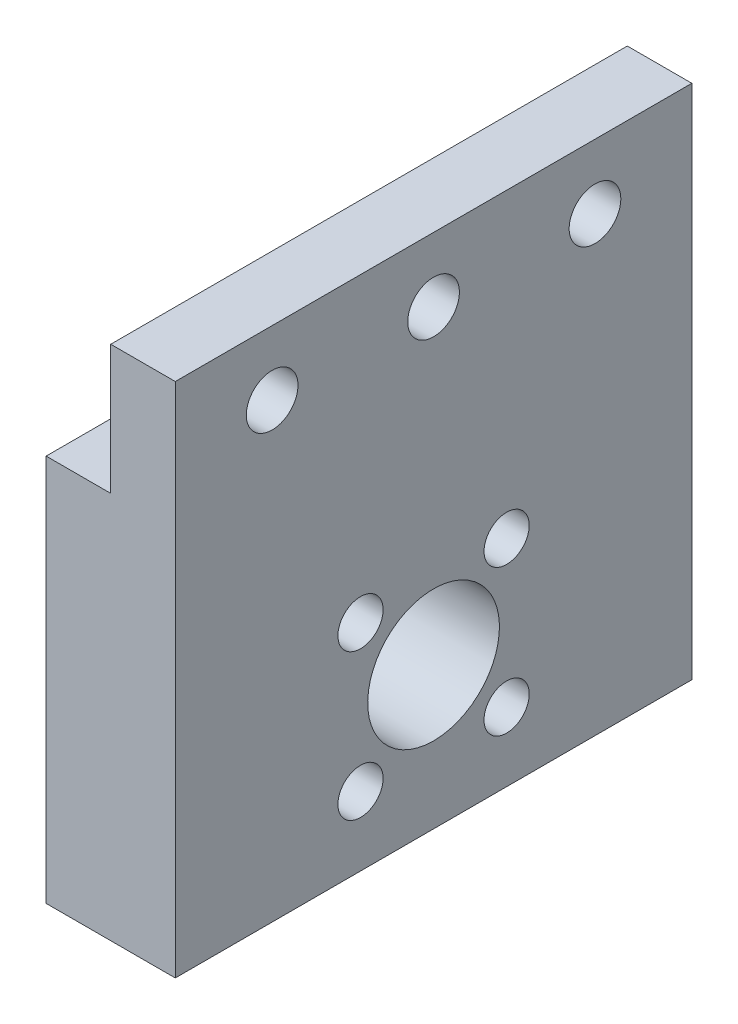
ISO-10303-21;
HEADER;
FILE_DESCRIPTION(('STEP AP214'),'2;1');
FILE_NAME('part.step','',(''),(''),'','','');
FILE_SCHEMA(('AUTOMOTIVE_DESIGN { 1 0 10303 214 1 1 1 1 }'));
ENDSEC;
DATA;
#1=APPLICATION_CONTEXT('core data for automotive mechanical design processes');
#2=APPLICATION_PROTOCOL_DEFINITION('international standard','automotive_design',2000,#1);
#3=PRODUCT_CONTEXT('',#1,'mechanical');
#4=PRODUCT('Part','Part','',(#3));
#5=PRODUCT_RELATED_PRODUCT_CATEGORY('part','',(#4));
#6=PRODUCT_DEFINITION_FORMATION('','',#4);
#7=PRODUCT_DEFINITION_CONTEXT('part definition',#1,'design');
#8=PRODUCT_DEFINITION('design','',#6,#7);
#9=PRODUCT_DEFINITION_SHAPE('','',#8);
#10=(LENGTH_UNIT() NAMED_UNIT(*) SI_UNIT(.MILLI.,.METRE.));
#11=(NAMED_UNIT(*) PLANE_ANGLE_UNIT() SI_UNIT($,.RADIAN.));
#12=(NAMED_UNIT(*) SI_UNIT($,.STERADIAN.) SOLID_ANGLE_UNIT());
#13=UNCERTAINTY_MEASURE_WITH_UNIT(LENGTH_MEASURE(1.E-05),#10,'distance_accuracy_value','');
#14=(GEOMETRIC_REPRESENTATION_CONTEXT(3) GLOBAL_UNCERTAINTY_ASSIGNED_CONTEXT((#13)) GLOBAL_UNIT_ASSIGNED_CONTEXT((#10,
#11,#12)) REPRESENTATION_CONTEXT('',''));
#15=CARTESIAN_POINT('',(0.,0.,0.));
#16=DIRECTION('',(0.,0.,1.));
#17=DIRECTION('',(1.,0.,0.));
#18=AXIS2_PLACEMENT_3D('',#15,#16,#17);
#19=CARTESIAN_POINT('',(-10.,0.,20.));
#20=DIRECTION('',(0.,1.,0.));
#21=DIRECTION('',(0.,0.,1.));
#22=AXIS2_PLACEMENT_3D('',#19,#20,#21);
#23=PLANE('',#22);
#24=DIRECTION('',(1.,0.,0.));
#25=VECTOR('',#24,1.);
#26=CARTESIAN_POINT('',(-10.,0.,-20.));
#27=LINE('',#26,#25);
#28=CARTESIAN_POINT('',(-10.,0.,-20.));
#29=VERTEX_POINT('',#28);
#30=CARTESIAN_POINT('',(0.,0.,-20.));
#31=VERTEX_POINT('',#30);
#32=EDGE_CURVE('E110',#29,#31,#27,.T.);
#33=ORIENTED_EDGE('',*,*,#32,.T.);
#34=DIRECTION('',(0.,0.,-1.));
#35=VECTOR('',#34,1.);
#36=CARTESIAN_POINT('',(0.,0.,20.));
#37=LINE('',#36,#35);
#38=CARTESIAN_POINT('',(0.,0.,20.));
#39=VERTEX_POINT('',#38);
#40=EDGE_CURVE('E12',#39,#31,#37,.T.);
#41=ORIENTED_EDGE('',*,*,#40,.F.);
#42=DIRECTION('',(1.,0.,0.));
#43=VECTOR('',#42,1.);
#44=CARTESIAN_POINT('',(-10.,0.,20.));
#45=LINE('',#44,#43);
#46=CARTESIAN_POINT('',(-10.,0.,20.));
#47=VERTEX_POINT('',#46);
#48=EDGE_CURVE('E104',#47,#39,#45,.T.);
#49=ORIENTED_EDGE('',*,*,#48,.F.);
#50=DIRECTION('',(0.,0.,-1.));
#51=VECTOR('',#50,1.);
#52=CARTESIAN_POINT('',(-10.,0.,20.));
#53=LINE('',#52,#51);
#54=EDGE_CURVE('E64',#47,#29,#53,.T.);
#55=ORIENTED_EDGE('',*,*,#54,.T.);
#56=EDGE_LOOP('',(#33,#41,#49,#55));
#57=FACE_BOUND('',#56,.T.);
#58=ADVANCED_FACE('F56',(#57),#23,.F.);
#59=CARTESIAN_POINT('',(0.,0.,20.));
#60=DIRECTION('',(-1.,0.,0.));
#61=DIRECTION('',(0.,0.,1.));
#62=AXIS2_PLACEMENT_3D('',#59,#60,#61);
#63=PLANE('',#62);
#64=CARTESIAN_POINT('',(0.,35.,12.5));
#65=DIRECTION('',(1.,0.,0.));
#66=DIRECTION('',(0.,0.,-1.));
#67=AXIS2_PLACEMENT_3D('',#64,#65,#66);
#68=CIRCLE('',#67,2.);
#69=CARTESIAN_POINT('',(0.,35.,10.5));
#70=VERTEX_POINT('',#69);
#71=EDGE_CURVE('E188',#70,#70,#68,.T.);
#72=ORIENTED_EDGE('',*,*,#71,.F.);
#73=EDGE_LOOP('',(#72));
#74=FACE_BOUND('',#73,.T.);
#75=CARTESIAN_POINT('',(0.,35.,0.));
#76=DIRECTION('',(1.,0.,0.));
#77=DIRECTION('',(0.,0.,-1.));
#78=AXIS2_PLACEMENT_3D('',#75,#76,#77);
#79=CIRCLE('',#78,2.);
#80=CARTESIAN_POINT('',(0.,35.,-2.));
#81=VERTEX_POINT('',#80);
#82=EDGE_CURVE('E182',#81,#81,#79,.T.);
#83=ORIENTED_EDGE('',*,*,#82,.F.);
#84=EDGE_LOOP('',(#83));
#85=FACE_BOUND('',#84,.T.);
#86=CARTESIAN_POINT('',(0.,35.,-12.5));
#87=DIRECTION('',(1.,0.,0.));
#88=DIRECTION('',(0.,0.,-1.));
#89=AXIS2_PLACEMENT_3D('',#86,#87,#88);
#90=CIRCLE('',#89,2.);
#91=CARTESIAN_POINT('',(0.,35.,-14.5));
#92=VERTEX_POINT('',#91);
#93=EDGE_CURVE('E176',#92,#92,#90,.T.);
#94=ORIENTED_EDGE('',*,*,#93,.F.);
#95=EDGE_LOOP('',(#94));
#96=FACE_BOUND('',#95,.T.);
#97=CARTESIAN_POINT('',(0.,5.34314575050762,5.65685424949238));
#98=DIRECTION('',(-1.,0.,0.));
#99=DIRECTION('',(0.,-1.,0.));
#100=AXIS2_PLACEMENT_3D('',#97,#98,#99);
#101=CIRCLE('',#100,1.75);
#102=CARTESIAN_POINT('',(0.,3.59314575050762,5.65685424949238));
#103=VERTEX_POINT('',#102);
#104=EDGE_CURVE('E130',#103,#103,#101,.T.);
#105=ORIENTED_EDGE('',*,*,#104,.T.);
#106=EDGE_LOOP('',(#105));
#107=FACE_BOUND('',#106,.T.);
#108=CARTESIAN_POINT('',(0.,5.34314575050762,-5.65685424949238));
#109=DIRECTION('',(-1.,0.,0.));
#110=DIRECTION('',(0.,-1.,0.));
#111=AXIS2_PLACEMENT_3D('',#108,#109,#110);
#112=CIRCLE('',#111,1.75);
#113=CARTESIAN_POINT('',(0.,3.59314575050762,-5.65685424949238));
#114=VERTEX_POINT('',#113);
#115=EDGE_CURVE('E137',#114,#114,#112,.T.);
#116=ORIENTED_EDGE('',*,*,#115,.T.);
#117=EDGE_LOOP('',(#116));
#118=FACE_BOUND('',#117,.T.);
#119=CARTESIAN_POINT('',(0.,16.6568542494924,-5.65685424949238));
#120=DIRECTION('',(-1.,0.,0.));
#121=DIRECTION('',(0.,-1.,0.));
#122=AXIS2_PLACEMENT_3D('',#119,#120,#121);
#123=CIRCLE('',#122,1.75);
#124=CARTESIAN_POINT('',(0.,14.9068542494924,-5.65685424949238));
#125=VERTEX_POINT('',#124);
#126=EDGE_CURVE('E143',#125,#125,#123,.T.);
#127=ORIENTED_EDGE('',*,*,#126,.T.);
#128=EDGE_LOOP('',(#127));
#129=FACE_BOUND('',#128,.T.);
#130=CARTESIAN_POINT('',(0.,16.6568542494924,5.65685424949238));
#131=DIRECTION('',(-1.,0.,0.));
#132=DIRECTION('',(0.,-1.,0.));
#133=AXIS2_PLACEMENT_3D('',#130,#131,#132);
#134=CIRCLE('',#133,1.75);
#135=CARTESIAN_POINT('',(0.,14.9068542494924,5.65685424949238));
#136=VERTEX_POINT('',#135);
#137=EDGE_CURVE('E149',#136,#136,#134,.T.);
#138=ORIENTED_EDGE('',*,*,#137,.T.);
#139=EDGE_LOOP('',(#138));
#140=FACE_BOUND('',#139,.T.);
#141=CARTESIAN_POINT('',(0.,11.,0.));
#142=DIRECTION('',(-1.,0.,0.));
#143=DIRECTION('',(0.,-1.,0.));
#144=AXIS2_PLACEMENT_3D('',#141,#142,#143);
#145=CIRCLE('',#144,5.1);
#146=CARTESIAN_POINT('',(0.,5.9,0.));
#147=VERTEX_POINT('',#146);
#148=EDGE_CURVE('E115',#147,#147,#145,.T.);
#149=ORIENTED_EDGE('',*,*,#148,.T.);
#150=EDGE_LOOP('',(#149));
#151=FACE_BOUND('',#150,.T.);
#152=DIRECTION('',(0.,1.,0.));
#153=VECTOR('',#152,1.);
#154=CARTESIAN_POINT('',(0.,0.,-20.));
#155=LINE('',#154,#153);
#156=CARTESIAN_POINT('',(0.,40.,-20.));
#157=VERTEX_POINT('',#156);
#158=EDGE_CURVE('E105',#31,#157,#155,.T.);
#159=ORIENTED_EDGE('',*,*,#158,.T.);
#160=DIRECTION('',(0.,0.,1.));
#161=VECTOR('',#160,1.);
#162=CARTESIAN_POINT('',(0.,40.,-20.));
#163=LINE('',#162,#161);
#164=CARTESIAN_POINT('',(0.,40.,20.));
#165=VERTEX_POINT('',#164);
#166=EDGE_CURVE('E134',#157,#165,#163,.T.);
#167=ORIENTED_EDGE('',*,*,#166,.T.);
#168=DIRECTION('',(0.,1.,0.));
#169=VECTOR('',#168,1.);
#170=CARTESIAN_POINT('',(0.,0.,20.));
#171=LINE('',#170,#169);
#172=EDGE_CURVE('E123',#39,#165,#171,.T.);
#173=ORIENTED_EDGE('',*,*,#172,.F.);
#174=ORIENTED_EDGE('',*,*,#40,.T.);
#175=EDGE_LOOP('',(#159,#167,#173,#174));
#176=FACE_BOUND('',#175,.T.);
#177=ADVANCED_FACE('F195',(#74,#85,#96,#107,#118,#129,#140,#151,#176),#63,.F.);
#178=CARTESIAN_POINT('',(-10.,55.,20.));
#179=DIRECTION('',(1.,0.,0.));
#180=DIRECTION('',(0.,1.,0.));
#181=AXIS2_PLACEMENT_3D('',#178,#179,#180);
#182=PLANE('',#181);
#183=CARTESIAN_POINT('',(-10.,5.34314575050762,5.65685424949238));
#184=DIRECTION('',(-1.,0.,0.));
#185=DIRECTION('',(0.,-1.,0.));
#186=AXIS2_PLACEMENT_3D('',#183,#184,#185);
#187=CIRCLE('',#186,1.75);
#188=CARTESIAN_POINT('',(-10.,3.59314575050762,5.65685424949238));
#189=VERTEX_POINT('',#188);
#190=EDGE_CURVE('E133',#189,#189,#187,.T.);
#191=ORIENTED_EDGE('',*,*,#190,.F.);
#192=EDGE_LOOP('',(#191));
#193=FACE_BOUND('',#192,.T.);
#194=CARTESIAN_POINT('',(-10.,5.34314575050762,-5.65685424949238));
#195=DIRECTION('',(-1.,0.,0.));
#196=DIRECTION('',(0.,-1.,0.));
#197=AXIS2_PLACEMENT_3D('',#194,#195,#196);
#198=CIRCLE('',#197,1.75);
#199=CARTESIAN_POINT('',(-10.,3.59314575050762,-5.65685424949238));
#200=VERTEX_POINT('',#199);
#201=EDGE_CURVE('E140',#200,#200,#198,.T.);
#202=ORIENTED_EDGE('',*,*,#201,.F.);
#203=EDGE_LOOP('',(#202));
#204=FACE_BOUND('',#203,.T.);
#205=CARTESIAN_POINT('',(-10.,16.6568542494924,-5.65685424949238));
#206=DIRECTION('',(-1.,0.,0.));
#207=DIRECTION('',(0.,-1.,0.));
#208=AXIS2_PLACEMENT_3D('',#205,#206,#207);
#209=CIRCLE('',#208,1.75);
#210=CARTESIAN_POINT('',(-10.,14.9068542494924,-5.65685424949238));
#211=VERTEX_POINT('',#210);
#212=EDGE_CURVE('E146',#211,#211,#209,.T.);
#213=ORIENTED_EDGE('',*,*,#212,.F.);
#214=EDGE_LOOP('',(#213));
#215=FACE_BOUND('',#214,.T.);
#216=CARTESIAN_POINT('',(-10.,16.6568542494924,5.65685424949238));
#217=DIRECTION('',(-1.,0.,0.));
#218=DIRECTION('',(0.,-1.,0.));
#219=AXIS2_PLACEMENT_3D('',#216,#217,#218);
#220=CIRCLE('',#219,1.75);
#221=CARTESIAN_POINT('',(-10.,14.9068542494924,5.65685424949238));
#222=VERTEX_POINT('',#221);
#223=EDGE_CURVE('E128',#222,#222,#220,.T.);
#224=ORIENTED_EDGE('',*,*,#223,.F.);
#225=EDGE_LOOP('',(#224));
#226=FACE_BOUND('',#225,.T.);
#227=CARTESIAN_POINT('',(-10.,11.,0.));
#228=DIRECTION('',(-1.,0.,0.));
#229=DIRECTION('',(0.,-1.,0.));
#230=AXIS2_PLACEMENT_3D('',#227,#228,#229);
#231=CIRCLE('',#230,5.1);
#232=CARTESIAN_POINT('',(-10.,5.9,0.));
#233=VERTEX_POINT('',#232);
#234=EDGE_CURVE('E119',#233,#233,#231,.T.);
#235=ORIENTED_EDGE('',*,*,#234,.F.);
#236=EDGE_LOOP('',(#235));
#237=FACE_BOUND('',#236,.T.);
#238=DIRECTION('',(0.,-1.,0.));
#239=VECTOR('',#238,1.);
#240=CARTESIAN_POINT('',(-10.,55.,20.));
#241=LINE('',#240,#239);
#242=CARTESIAN_POINT('',(-10.,30.,20.));
#243=VERTEX_POINT('',#242);
#244=EDGE_CURVE('E80',#243,#47,#241,.T.);
#245=ORIENTED_EDGE('',*,*,#244,.F.);
#246=DIRECTION('',(0.,0.,1.));
#247=VECTOR('',#246,1.);
#248=CARTESIAN_POINT('',(-10.,30.,-20.));
#249=LINE('',#248,#247);
#250=CARTESIAN_POINT('',(-10.,30.,-20.));
#251=VERTEX_POINT('',#250);
#252=EDGE_CURVE('E100',#251,#243,#249,.T.);
#253=ORIENTED_EDGE('',*,*,#252,.F.);
#254=DIRECTION('',(0.,-1.,0.));
#255=VECTOR('',#254,1.);
#256=CARTESIAN_POINT('',(-10.,55.,-20.));
#257=LINE('',#256,#255);
#258=EDGE_CURVE('E94',#251,#29,#257,.T.);
#259=ORIENTED_EDGE('',*,*,#258,.T.);
#260=ORIENTED_EDGE('',*,*,#54,.F.);
#261=EDGE_LOOP('',(#245,#253,#259,#260));
#262=FACE_BOUND('',#261,.T.);
#263=ADVANCED_FACE('F96',(#193,#204,#215,#226,#237,#262),#182,.F.);
#264=CARTESIAN_POINT('',(0.,0.,20.));
#265=DIRECTION('',(0.,0.,1.));
#266=DIRECTION('',(1.,0.,0.));
#267=AXIS2_PLACEMENT_3D('',#264,#265,#266);
#268=PLANE('',#267);
#269=DIRECTION('',(1.,0.,0.));
#270=VECTOR('',#269,1.);
#271=CARTESIAN_POINT('',(-5.,40.,20.));
#272=LINE('',#271,#270);
#273=CARTESIAN_POINT('',(-5.,40.,20.));
#274=VERTEX_POINT('',#273);
#275=EDGE_CURVE('E163',#274,#165,#272,.T.);
#276=ORIENTED_EDGE('',*,*,#275,.F.);
#277=DIRECTION('',(0.,1.,0.));
#278=VECTOR('',#277,1.);
#279=CARTESIAN_POINT('',(-5.,30.,20.));
#280=LINE('',#279,#278);
#281=CARTESIAN_POINT('',(-5.,30.,20.));
#282=VERTEX_POINT('',#281);
#283=EDGE_CURVE('E167',#282,#274,#280,.T.);
#284=ORIENTED_EDGE('',*,*,#283,.F.);
#285=DIRECTION('',(1.,0.,0.));
#286=VECTOR('',#285,1.);
#287=CARTESIAN_POINT('',(-10.,30.,20.));
#288=LINE('',#287,#286);
#289=EDGE_CURVE('E170',#243,#282,#288,.T.);
#290=ORIENTED_EDGE('',*,*,#289,.F.);
#291=ORIENTED_EDGE('',*,*,#244,.T.);
#292=ORIENTED_EDGE('',*,*,#48,.T.);
#293=ORIENTED_EDGE('',*,*,#172,.T.);
#294=EDGE_LOOP('',(#276,#284,#290,#291,#292,#293));
#295=FACE_BOUND('',#294,.T.);
#296=ADVANCED_FACE('F233',(#295),#268,.T.);
#297=CARTESIAN_POINT('',(0.,0.,-20.));
#298=DIRECTION('',(0.,0.,1.));
#299=DIRECTION('',(1.,0.,0.));
#300=AXIS2_PLACEMENT_3D('',#297,#298,#299);
#301=PLANE('',#300);
#302=DIRECTION('',(0.,1.,0.));
#303=VECTOR('',#302,1.);
#304=CARTESIAN_POINT('',(-5.,30.,-20.));
#305=LINE('',#304,#303);
#306=CARTESIAN_POINT('',(-5.,30.,-20.));
#307=VERTEX_POINT('',#306);
#308=CARTESIAN_POINT('',(-5.,40.,-20.));
#309=VERTEX_POINT('',#308);
#310=EDGE_CURVE('E71',#307,#309,#305,.T.);
#311=ORIENTED_EDGE('',*,*,#310,.T.);
#312=DIRECTION('',(1.,0.,0.));
#313=VECTOR('',#312,1.);
#314=CARTESIAN_POINT('',(-5.,40.,-20.));
#315=LINE('',#314,#313);
#316=EDGE_CURVE('E156',#309,#157,#315,.T.);
#317=ORIENTED_EDGE('',*,*,#316,.T.);
#318=ORIENTED_EDGE('',*,*,#158,.F.);
#319=ORIENTED_EDGE('',*,*,#32,.F.);
#320=ORIENTED_EDGE('',*,*,#258,.F.);
#321=DIRECTION('',(1.,0.,0.));
#322=VECTOR('',#321,1.);
#323=CARTESIAN_POINT('',(-10.,30.,-20.));
#324=LINE('',#323,#322);
#325=EDGE_CURVE('E166',#251,#307,#324,.T.);
#326=ORIENTED_EDGE('',*,*,#325,.T.);
#327=EDGE_LOOP('',(#311,#317,#318,#319,#320,#326));
#328=FACE_BOUND('',#327,.T.);
#329=ADVANCED_FACE('F112',(#328),#301,.F.);
#330=CARTESIAN_POINT('',(0.,11.,0.));
#331=DIRECTION('',(-1.,0.,0.));
#332=DIRECTION('',(0.,-1.,0.));
#333=AXIS2_PLACEMENT_3D('',#330,#331,#332);
#334=CYLINDRICAL_SURFACE('',#333,5.1);
#335=ORIENTED_EDGE('',*,*,#148,.F.);
#336=EDGE_LOOP('',(#335));
#337=FACE_BOUND('',#336,.T.);
#338=ORIENTED_EDGE('',*,*,#234,.T.);
#339=EDGE_LOOP('',(#338));
#340=FACE_BOUND('',#339,.T.);
#341=ADVANCED_FACE('F240',(#337,#340),#334,.F.);
#342=CARTESIAN_POINT('',(0.,16.6568542494924,5.65685424949238));
#343=DIRECTION('',(-1.,0.,0.));
#344=DIRECTION('',(0.,-1.,0.));
#345=AXIS2_PLACEMENT_3D('',#342,#343,#344);
#346=CYLINDRICAL_SURFACE('',#345,1.75);
#347=ORIENTED_EDGE('',*,*,#137,.F.);
#348=EDGE_LOOP('',(#347));
#349=FACE_BOUND('',#348,.T.);
#350=ORIENTED_EDGE('',*,*,#223,.T.);
#351=EDGE_LOOP('',(#350));
#352=FACE_BOUND('',#351,.T.);
#353=ADVANCED_FACE('F281',(#349,#352),#346,.F.);
#354=CARTESIAN_POINT('',(0.,16.6568542494924,-5.65685424949238));
#355=DIRECTION('',(-1.,0.,0.));
#356=DIRECTION('',(0.,-1.,0.));
#357=AXIS2_PLACEMENT_3D('',#354,#355,#356);
#358=CYLINDRICAL_SURFACE('',#357,1.75);
#359=ORIENTED_EDGE('',*,*,#126,.F.);
#360=EDGE_LOOP('',(#359));
#361=FACE_BOUND('',#360,.T.);
#362=ORIENTED_EDGE('',*,*,#212,.T.);
#363=EDGE_LOOP('',(#362));
#364=FACE_BOUND('',#363,.T.);
#365=ADVANCED_FACE('F287',(#361,#364),#358,.F.);
#366=CARTESIAN_POINT('',(0.,5.34314575050762,-5.65685424949238));
#367=DIRECTION('',(-1.,0.,0.));
#368=DIRECTION('',(0.,-1.,0.));
#369=AXIS2_PLACEMENT_3D('',#366,#367,#368);
#370=CYLINDRICAL_SURFACE('',#369,1.75);
#371=ORIENTED_EDGE('',*,*,#115,.F.);
#372=EDGE_LOOP('',(#371));
#373=FACE_BOUND('',#372,.T.);
#374=ORIENTED_EDGE('',*,*,#201,.T.);
#375=EDGE_LOOP('',(#374));
#376=FACE_BOUND('',#375,.T.);
#377=ADVANCED_FACE('F295',(#373,#376),#370,.F.);
#378=CARTESIAN_POINT('',(0.,5.34314575050762,5.65685424949238));
#379=DIRECTION('',(-1.,0.,0.));
#380=DIRECTION('',(0.,-1.,0.));
#381=AXIS2_PLACEMENT_3D('',#378,#379,#380);
#382=CYLINDRICAL_SURFACE('',#381,1.75);
#383=ORIENTED_EDGE('',*,*,#104,.F.);
#384=EDGE_LOOP('',(#383));
#385=FACE_BOUND('',#384,.T.);
#386=ORIENTED_EDGE('',*,*,#190,.T.);
#387=EDGE_LOOP('',(#386));
#388=FACE_BOUND('',#387,.T.);
#389=ADVANCED_FACE('F303',(#385,#388),#382,.F.);
#390=CARTESIAN_POINT('',(-5.,40.,-20.));
#391=DIRECTION('',(0.,-1.,0.));
#392=DIRECTION('',(0.,0.,-1.));
#393=AXIS2_PLACEMENT_3D('',#390,#391,#392);
#394=PLANE('',#393);
#395=ORIENTED_EDGE('',*,*,#275,.T.);
#396=ORIENTED_EDGE('',*,*,#166,.F.);
#397=ORIENTED_EDGE('',*,*,#316,.F.);
#398=DIRECTION('',(0.,0.,1.));
#399=VECTOR('',#398,1.);
#400=CARTESIAN_POINT('',(-5.,40.,-20.));
#401=LINE('',#400,#399);
#402=EDGE_CURVE('E158',#309,#274,#401,.T.);
#403=ORIENTED_EDGE('',*,*,#402,.T.);
#404=EDGE_LOOP('',(#395,#396,#397,#403));
#405=FACE_BOUND('',#404,.T.);
#406=ADVANCED_FACE('F230',(#405),#394,.F.);
#407=CARTESIAN_POINT('',(-5.,30.,-20.));
#408=DIRECTION('',(1.,0.,0.));
#409=DIRECTION('',(0.,0.,-1.));
#410=AXIS2_PLACEMENT_3D('',#407,#408,#409);
#411=PLANE('',#410);
#412=CARTESIAN_POINT('',(-5.,35.,12.5));
#413=DIRECTION('',(1.,0.,0.));
#414=DIRECTION('',(0.,0.,-1.));
#415=AXIS2_PLACEMENT_3D('',#412,#413,#414);
#416=CIRCLE('',#415,2.);
#417=CARTESIAN_POINT('',(-5.,35.,10.5));
#418=VERTEX_POINT('',#417);
#419=EDGE_CURVE('E185',#418,#418,#416,.T.);
#420=ORIENTED_EDGE('',*,*,#419,.T.);
#421=EDGE_LOOP('',(#420));
#422=FACE_BOUND('',#421,.T.);
#423=CARTESIAN_POINT('',(-5.,35.,0.));
#424=DIRECTION('',(1.,0.,0.));
#425=DIRECTION('',(0.,0.,-1.));
#426=AXIS2_PLACEMENT_3D('',#423,#424,#425);
#427=CIRCLE('',#426,2.);
#428=CARTESIAN_POINT('',(-5.,35.,-2.));
#429=VERTEX_POINT('',#428);
#430=EDGE_CURVE('E179',#429,#429,#427,.T.);
#431=ORIENTED_EDGE('',*,*,#430,.T.);
#432=EDGE_LOOP('',(#431));
#433=FACE_BOUND('',#432,.T.);
#434=CARTESIAN_POINT('',(-5.,35.,-12.5));
#435=DIRECTION('',(1.,0.,0.));
#436=DIRECTION('',(0.,0.,-1.));
#437=AXIS2_PLACEMENT_3D('',#434,#435,#436);
#438=CIRCLE('',#437,2.);
#439=CARTESIAN_POINT('',(-5.,35.,-14.5));
#440=VERTEX_POINT('',#439);
#441=EDGE_CURVE('E59',#440,#440,#438,.T.);
#442=ORIENTED_EDGE('',*,*,#441,.T.);
#443=EDGE_LOOP('',(#442));
#444=FACE_BOUND('',#443,.T.);
#445=ORIENTED_EDGE('',*,*,#283,.T.);
#446=ORIENTED_EDGE('',*,*,#402,.F.);
#447=ORIENTED_EDGE('',*,*,#310,.F.);
#448=DIRECTION('',(0.,0.,1.));
#449=VECTOR('',#448,1.);
#450=CARTESIAN_POINT('',(-5.,30.,-20.));
#451=LINE('',#450,#449);
#452=EDGE_CURVE('E155',#307,#282,#451,.T.);
#453=ORIENTED_EDGE('',*,*,#452,.T.);
#454=EDGE_LOOP('',(#445,#446,#447,#453));
#455=FACE_BOUND('',#454,.T.);
#456=ADVANCED_FACE('F232',(#422,#433,#444,#455),#411,.F.);
#457=CARTESIAN_POINT('',(-10.,30.,-20.));
#458=DIRECTION('',(0.,-1.,0.));
#459=DIRECTION('',(0.,0.,-1.));
#460=AXIS2_PLACEMENT_3D('',#457,#458,#459);
#461=PLANE('',#460);
#462=ORIENTED_EDGE('',*,*,#289,.T.);
#463=ORIENTED_EDGE('',*,*,#452,.F.);
#464=ORIENTED_EDGE('',*,*,#325,.F.);
#465=ORIENTED_EDGE('',*,*,#252,.T.);
#466=EDGE_LOOP('',(#462,#463,#464,#465));
#467=FACE_BOUND('',#466,.T.);
#468=ADVANCED_FACE('F229',(#467),#461,.F.);
#469=CARTESIAN_POINT('',(0.,35.,-12.5));
#470=DIRECTION('',(1.,0.,0.));
#471=DIRECTION('',(0.,0.,-1.));
#472=AXIS2_PLACEMENT_3D('',#469,#470,#471);
#473=CYLINDRICAL_SURFACE('',#472,2.);
#474=ORIENTED_EDGE('',*,*,#93,.T.);
#475=EDGE_LOOP('',(#474));
#476=FACE_BOUND('',#475,.T.);
#477=ORIENTED_EDGE('',*,*,#441,.F.);
#478=EDGE_LOOP('',(#477));
#479=FACE_BOUND('',#478,.T.);
#480=ADVANCED_FACE('F328',(#476,#479),#473,.F.);
#481=CARTESIAN_POINT('',(0.,35.,0.));
#482=DIRECTION('',(1.,0.,0.));
#483=DIRECTION('',(0.,0.,-1.));
#484=AXIS2_PLACEMENT_3D('',#481,#482,#483);
#485=CYLINDRICAL_SURFACE('',#484,2.);
#486=ORIENTED_EDGE('',*,*,#82,.T.);
#487=EDGE_LOOP('',(#486));
#488=FACE_BOUND('',#487,.T.);
#489=ORIENTED_EDGE('',*,*,#430,.F.);
#490=EDGE_LOOP('',(#489));
#491=FACE_BOUND('',#490,.T.);
#492=ADVANCED_FACE('F334',(#488,#491),#485,.F.);
#493=CARTESIAN_POINT('',(0.,35.,12.5));
#494=DIRECTION('',(1.,0.,0.));
#495=DIRECTION('',(0.,0.,-1.));
#496=AXIS2_PLACEMENT_3D('',#493,#494,#495);
#497=CYLINDRICAL_SURFACE('',#496,2.);
#498=ORIENTED_EDGE('',*,*,#71,.T.);
#499=EDGE_LOOP('',(#498));
#500=FACE_BOUND('',#499,.T.);
#501=ORIENTED_EDGE('',*,*,#419,.F.);
#502=EDGE_LOOP('',(#501));
#503=FACE_BOUND('',#502,.T.);
#504=ADVANCED_FACE('F192',(#500,#503),#497,.F.);
#505=CLOSED_SHELL('',(#58,#177,#263,#296,#329,#341,#353,#365,#377,#389,#406,#456,#468,#480,#492,#504));
#506=MANIFOLD_SOLID_BREP('B2',#505);
#507=ADVANCED_BREP_SHAPE_REPRESENTATION('',(#18,#506),#14);
#508=SHAPE_DEFINITION_REPRESENTATION(#9,#507);
ENDSEC;
END-ISO-10303-21;
